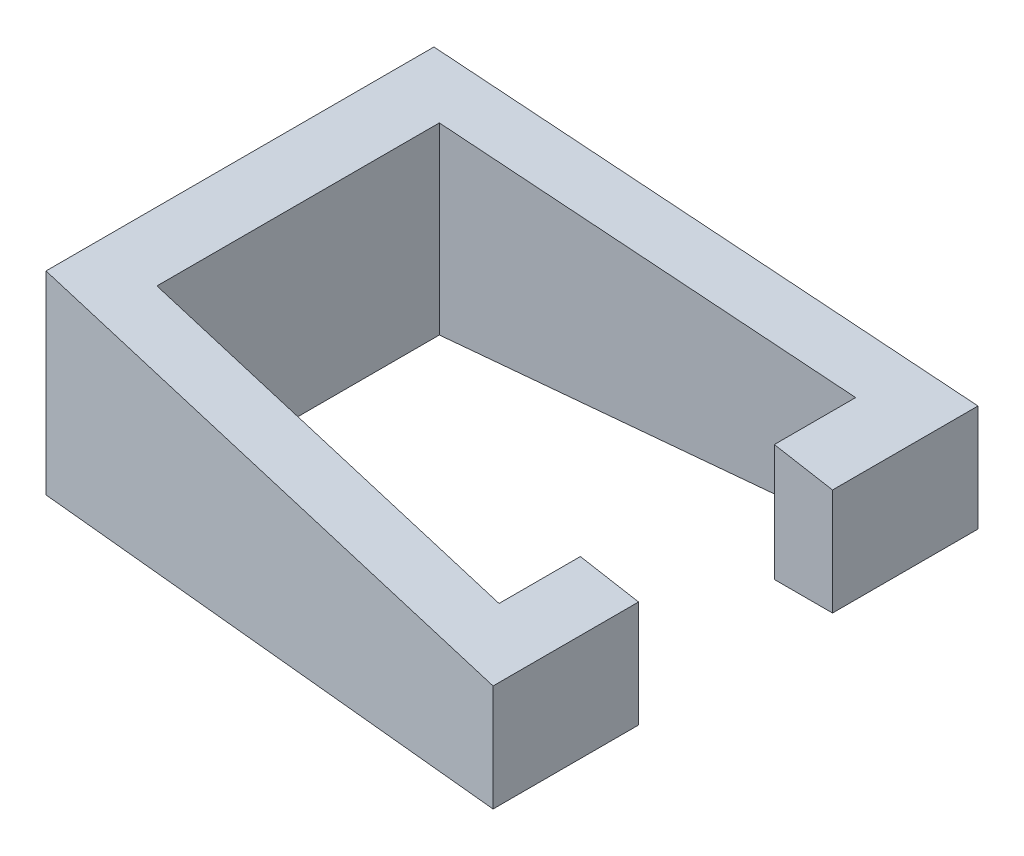
ISO-10303-21;
HEADER;
FILE_DESCRIPTION(('STEP AP214'),'2;1');
FILE_NAME('part.step','',(''),(''),'','','');
FILE_SCHEMA(('AUTOMOTIVE_DESIGN { 1 0 10303 214 1 1 1 1 }'));
ENDSEC;
DATA;
#1=APPLICATION_CONTEXT('core data for automotive mechanical design processes');
#2=APPLICATION_PROTOCOL_DEFINITION('international standard','automotive_design',2000,#1);
#3=PRODUCT_CONTEXT('',#1,'mechanical');
#4=PRODUCT('Part','Part','',(#3));
#5=PRODUCT_RELATED_PRODUCT_CATEGORY('part','',(#4));
#6=PRODUCT_DEFINITION_FORMATION('','',#4);
#7=PRODUCT_DEFINITION_CONTEXT('part definition',#1,'design');
#8=PRODUCT_DEFINITION('design','',#6,#7);
#9=PRODUCT_DEFINITION_SHAPE('','',#8);
#10=(LENGTH_UNIT() NAMED_UNIT(*) SI_UNIT(.MILLI.,.METRE.));
#11=(NAMED_UNIT(*) PLANE_ANGLE_UNIT() SI_UNIT($,.RADIAN.));
#12=(NAMED_UNIT(*) SI_UNIT($,.STERADIAN.) SOLID_ANGLE_UNIT());
#13=UNCERTAINTY_MEASURE_WITH_UNIT(LENGTH_MEASURE(1.E-05),#10,'distance_accuracy_value','');
#14=(GEOMETRIC_REPRESENTATION_CONTEXT(3) GLOBAL_UNCERTAINTY_ASSIGNED_CONTEXT((#13)) GLOBAL_UNIT_ASSIGNED_CONTEXT((#10,
#11,#12)) REPRESENTATION_CONTEXT('',''));
#15=CARTESIAN_POINT('',(0.,0.,0.));
#16=DIRECTION('',(0.,0.,1.));
#17=DIRECTION('',(1.,0.,0.));
#18=AXIS2_PLACEMENT_3D('',#15,#16,#17);
#19=CARTESIAN_POINT('',(-10.7676915472071,15.,10.));
#20=DIRECTION('',(0.0973899493572263,0.,-0.995246300050493));
#21=DIRECTION('',(-0.995246300050494,0.,-0.0973899493572264));
#22=AXIS2_PLACEMENT_3D('',#19,#20,#21);
#23=PLANE('',#22);
#24=DIRECTION('',(0.,-1.,0.));
#25=VECTOR('',#24,1.);
#26=CARTESIAN_POINT('',(14.7802809750891,15.,12.5));
#27=LINE('',#26,#25);
#28=CARTESIAN_POINT('',(14.7802809750891,5.49520314192087,12.5));
#29=VERTEX_POINT('',#28);
#30=CARTESIAN_POINT('',(14.7802809750891,0.,12.5));
#31=VERTEX_POINT('',#30);
#32=EDGE_CURVE('E11',#29,#31,#27,.T.);
#33=ORIENTED_EDGE('',*,*,#32,.F.);
#34=DIRECTION('',(-0.980266461448434,0.172847425436966,-0.0959240954045315));
#35=VECTOR('',#34,1.);
#36=CARTESIAN_POINT('',(-11.6148742177249,10.1493811624009,9.91709883535978));
#37=LINE('',#36,#35);
#38=CARTESIAN_POINT('',(-10.7676915472071,10.,10.));
#39=VERTEX_POINT('',#38);
#40=EDGE_CURVE('E119',#29,#39,#37,.T.);
#41=ORIENTED_EDGE('',*,*,#40,.T.);
#42=DIRECTION('',(0.,-1.,0.));
#43=VECTOR('',#42,1.);
#44=CARTESIAN_POINT('',(-10.7676915472071,15.,10.));
#45=LINE('',#44,#43);
#46=CARTESIAN_POINT('',(-10.7676915472071,0.,10.));
#47=VERTEX_POINT('',#46);
#48=EDGE_CURVE('E55',#39,#47,#45,.T.);
#49=ORIENTED_EDGE('',*,*,#48,.T.);
#50=DIRECTION('',(0.995246300050494,0.,0.0973899493572263));
#51=VECTOR('',#50,1.);
#52=CARTESIAN_POINT('',(-10.7676915472071,0.,10.));
#53=LINE('',#52,#51);
#54=EDGE_CURVE('E126',#47,#31,#53,.T.);
#55=ORIENTED_EDGE('',*,*,#54,.T.);
#56=EDGE_LOOP('',(#33,#41,#49,#55));
#57=FACE_BOUND('',#56,.T.);
#58=ADVANCED_FACE('F33',(#57),#23,.F.);
#59=CARTESIAN_POINT('',(14.7802809750891,15.,12.5));
#60=DIRECTION('',(-1.,0.,0.));
#61=DIRECTION('',(0.,0.,1.));
#62=AXIS2_PLACEMENT_3D('',#59,#60,#61);
#63=PLANE('',#62);
#64=DIRECTION('',(0.,-1.,0.));
#65=VECTOR('',#64,1.);
#66=CARTESIAN_POINT('',(14.7802809750891,15.,5.));
#67=LINE('',#66,#65);
#68=CARTESIAN_POINT('',(14.7802809750891,5.49520314192087,5.));
#69=VERTEX_POINT('',#68);
#70=CARTESIAN_POINT('',(14.7802809750891,0.,5.));
#71=VERTEX_POINT('',#70);
#72=EDGE_CURVE('E40',#69,#71,#67,.T.);
#73=ORIENTED_EDGE('',*,*,#72,.F.);
#74=DIRECTION('',(0.,0.,1.));
#75=VECTOR('',#74,1.);
#76=CARTESIAN_POINT('',(14.7802809750891,5.49520314192087,-12.5));
#77=LINE('',#76,#75);
#78=EDGE_CURVE('E122',#69,#29,#77,.T.);
#79=ORIENTED_EDGE('',*,*,#78,.T.);
#80=ORIENTED_EDGE('',*,*,#32,.T.);
#81=DIRECTION('',(0.,0.,-1.));
#82=VECTOR('',#81,1.);
#83=CARTESIAN_POINT('',(14.7802809750891,0.,12.5));
#84=LINE('',#83,#82);
#85=EDGE_CURVE('E139',#31,#71,#84,.T.);
#86=ORIENTED_EDGE('',*,*,#85,.T.);
#87=EDGE_LOOP('',(#73,#79,#80,#86));
#88=FACE_BOUND('',#87,.T.);
#89=ADVANCED_FACE('F131',(#88),#63,.F.);
#90=CARTESIAN_POINT('',(14.7802809750891,15.,5.));
#91=DIRECTION('',(0.,0.,1.));
#92=DIRECTION('',(1.,0.,0.));
#93=AXIS2_PLACEMENT_3D('',#90,#91,#92);
#94=PLANE('',#93);
#95=DIRECTION('',(0.,-1.,0.));
#96=VECTOR('',#95,1.);
#97=CARTESIAN_POINT('',(11.7802809750891,15.,5.));
#98=LINE('',#97,#96);
#99=CARTESIAN_POINT('',(11.7802809750891,6.02418408404625,5.));
#100=VERTEX_POINT('',#99);
#101=CARTESIAN_POINT('',(11.7802809750891,0.,5.));
#102=VERTEX_POINT('',#101);
#103=EDGE_CURVE('E190',#100,#102,#98,.T.);
#104=ORIENTED_EDGE('',*,*,#103,.F.);
#105=DIRECTION('',(0.984807753012209,-0.173648177666923,0.));
#106=VECTOR('',#105,1.);
#107=CARTESIAN_POINT('',(13.1548649832483,5.78180783615739,5.));
#108=LINE('',#107,#106);
#109=EDGE_CURVE('E127',#100,#69,#108,.T.);
#110=ORIENTED_EDGE('',*,*,#109,.T.);
#111=ORIENTED_EDGE('',*,*,#72,.T.);
#112=DIRECTION('',(-1.,0.,0.));
#113=VECTOR('',#112,1.);
#114=CARTESIAN_POINT('',(14.7802809750891,0.,5.));
#115=LINE('',#114,#113);
#116=EDGE_CURVE('E141',#71,#102,#115,.T.);
#117=ORIENTED_EDGE('',*,*,#116,.T.);
#118=EDGE_LOOP('',(#104,#110,#111,#117));
#119=FACE_BOUND('',#118,.T.);
#120=ADVANCED_FACE('F193',(#119),#94,.F.);
#121=CARTESIAN_POINT('',(11.7802809750891,15.,9.19210541359998));
#122=DIRECTION('',(1.,0.,0.));
#123=DIRECTION('',(0.,0.,-1.));
#124=AXIS2_PLACEMENT_3D('',#121,#122,#123);
#125=PLANE('',#124);
#126=DIRECTION('',(0.,-1.,0.));
#127=VECTOR('',#126,1.);
#128=CARTESIAN_POINT('',(11.7802809750891,15.,9.19210541359998));
#129=LINE('',#128,#127);
#130=CARTESIAN_POINT('',(11.7802809750891,6.02418408404624,9.19210541359998));
#131=VERTEX_POINT('',#130);
#132=CARTESIAN_POINT('',(11.7802809750891,0.,9.19210541359998));
#133=VERTEX_POINT('',#132);
#134=EDGE_CURVE('E188',#131,#133,#129,.T.);
#135=ORIENTED_EDGE('',*,*,#134,.F.);
#136=DIRECTION('',(0.,0.,-1.));
#137=VECTOR('',#136,1.);
#138=CARTESIAN_POINT('',(11.7802809750891,6.02418408404625,9.19210541359998));
#139=LINE('',#138,#137);
#140=EDGE_CURVE('E203',#131,#100,#139,.T.);
#141=ORIENTED_EDGE('',*,*,#140,.T.);
#142=ORIENTED_EDGE('',*,*,#103,.T.);
#143=DIRECTION('',(0.,0.,1.));
#144=VECTOR('',#143,1.);
#145=CARTESIAN_POINT('',(11.7802809750891,0.,9.19210541359998));
#146=LINE('',#145,#144);
#147=EDGE_CURVE('E147',#102,#133,#146,.T.);
#148=ORIENTED_EDGE('',*,*,#147,.T.);
#149=EDGE_LOOP('',(#135,#141,#142,#148));
#150=FACE_BOUND('',#149,.T.);
#151=ADVANCED_FACE('F201',(#150),#125,.F.);
#152=CARTESIAN_POINT('',(-7.76769154720711,15.,7.2792361531101));
#153=DIRECTION('',(-0.0973899493572264,0.,0.995246300050493));
#154=DIRECTION('',(0.995246300050494,0.,0.0973899493572264));
#155=AXIS2_PLACEMENT_3D('',#152,#153,#154);
#156=PLANE('',#155);
#157=DIRECTION('',(0.,-1.,0.));
#158=VECTOR('',#157,1.);
#159=CARTESIAN_POINT('',(-7.76769154720711,15.,7.2792361531101));
#160=LINE('',#159,#158);
#161=CARTESIAN_POINT('',(-7.76769154720711,9.47101905787463,7.2792361531101));
#162=VERTEX_POINT('',#161);
#163=CARTESIAN_POINT('',(-7.76769154720711,0.,7.2792361531101));
#164=VERTEX_POINT('',#163);
#165=EDGE_CURVE('E186',#162,#164,#160,.T.);
#166=ORIENTED_EDGE('',*,*,#165,.F.);
#167=DIRECTION('',(0.980266461448434,-0.172847425436966,0.0959240954045315));
#168=VECTOR('',#167,1.);
#169=CARTESIAN_POINT('',(-8.70450291516551,9.63620417788009,7.18756436123495));
#170=LINE('',#169,#168);
#171=EDGE_CURVE('E205',#162,#131,#170,.T.);
#172=ORIENTED_EDGE('',*,*,#171,.T.);
#173=ORIENTED_EDGE('',*,*,#134,.T.);
#174=DIRECTION('',(-0.995246300050493,0.,-0.0973899493572263));
#175=VECTOR('',#174,1.);
#176=CARTESIAN_POINT('',(-7.76769154720711,0.,7.2792361531101));
#177=LINE('',#176,#175);
#178=EDGE_CURVE('E150',#133,#164,#177,.T.);
#179=ORIENTED_EDGE('',*,*,#178,.T.);
#180=EDGE_LOOP('',(#166,#172,#173,#179));
#181=FACE_BOUND('',#180,.T.);
#182=ADVANCED_FACE('F258',(#181),#156,.F.);
#183=CARTESIAN_POINT('',(-7.76769154720711,15.,0.));
#184=DIRECTION('',(-1.,0.,0.));
#185=DIRECTION('',(0.,0.,1.));
#186=AXIS2_PLACEMENT_3D('',#183,#184,#185);
#187=PLANE('',#186);
#188=DIRECTION('',(0.,-1.,0.));
#189=VECTOR('',#188,1.);
#190=CARTESIAN_POINT('',(-7.76769154720711,15.,-7.2792361531101));
#191=LINE('',#190,#189);
#192=CARTESIAN_POINT('',(-7.76769154720711,9.47101905787462,-7.2792361531101));
#193=VERTEX_POINT('',#192);
#194=CARTESIAN_POINT('',(-7.76769154720711,0.,-7.2792361531101));
#195=VERTEX_POINT('',#194);
#196=EDGE_CURVE('E184',#193,#195,#191,.T.);
#197=ORIENTED_EDGE('',*,*,#196,.F.);
#198=DIRECTION('',(0.,0.,1.));
#199=VECTOR('',#198,1.);
#200=CARTESIAN_POINT('',(-7.76769154720711,9.47101905787463,0.));
#201=LINE('',#200,#199);
#202=EDGE_CURVE('E207',#193,#162,#201,.T.);
#203=ORIENTED_EDGE('',*,*,#202,.T.);
#204=ORIENTED_EDGE('',*,*,#165,.T.);
#205=DIRECTION('',(0.,0.,-1.));
#206=VECTOR('',#205,1.);
#207=CARTESIAN_POINT('',(-7.76769154720711,0.,0.));
#208=LINE('',#207,#206);
#209=EDGE_CURVE('E153',#164,#195,#208,.T.);
#210=ORIENTED_EDGE('',*,*,#209,.T.);
#211=EDGE_LOOP('',(#197,#203,#204,#210));
#212=FACE_BOUND('',#211,.T.);
#213=ADVANCED_FACE('F261',(#212),#187,.F.);
#214=CARTESIAN_POINT('',(-7.76769154720711,15.,-7.2792361531101));
#215=DIRECTION('',(-0.0973899493572263,0.,-0.995246300050494));
#216=DIRECTION('',(-0.995246300050494,0.,0.0973899493572263));
#217=AXIS2_PLACEMENT_3D('',#214,#215,#216);
#218=PLANE('',#217);
#219=DIRECTION('',(0.,-1.,0.));
#220=VECTOR('',#219,1.);
#221=CARTESIAN_POINT('',(11.7802809750891,15.,-9.19210541359998));
#222=LINE('',#221,#220);
#223=CARTESIAN_POINT('',(11.7802809750891,6.02418408404625,-9.19210541359998));
#224=VERTEX_POINT('',#223);
#225=CARTESIAN_POINT('',(11.7802809750891,0.,-9.19210541359998));
#226=VERTEX_POINT('',#225);
#227=EDGE_CURVE('E182',#224,#226,#222,.T.);
#228=ORIENTED_EDGE('',*,*,#227,.F.);
#229=DIRECTION('',(-0.980266461448434,0.172847425436966,0.0959240954045314));
#230=VECTOR('',#229,1.);
#231=CARTESIAN_POINT('',(-8.7045029151655,9.63620417788009,-7.18756436123495));
#232=LINE('',#231,#230);
#233=EDGE_CURVE('E212',#224,#193,#232,.T.);
#234=ORIENTED_EDGE('',*,*,#233,.T.);
#235=ORIENTED_EDGE('',*,*,#196,.T.);
#236=DIRECTION('',(0.995246300050494,0.,-0.0973899493572263));
#237=VECTOR('',#236,1.);
#238=CARTESIAN_POINT('',(-7.76769154720711,0.,-7.2792361531101));
#239=LINE('',#238,#237);
#240=EDGE_CURVE('E156',#195,#226,#239,.T.);
#241=ORIENTED_EDGE('',*,*,#240,.T.);
#242=EDGE_LOOP('',(#228,#234,#235,#241));
#243=FACE_BOUND('',#242,.T.);
#244=ADVANCED_FACE('F265',(#243),#218,.F.);
#245=CARTESIAN_POINT('',(11.7802809750891,15.,-9.19210541359998));
#246=DIRECTION('',(1.,0.,0.));
#247=DIRECTION('',(0.,0.,-1.));
#248=AXIS2_PLACEMENT_3D('',#245,#246,#247);
#249=PLANE('',#248);
#250=DIRECTION('',(0.,-1.,0.));
#251=VECTOR('',#250,1.);
#252=CARTESIAN_POINT('',(11.7802809750891,15.,-5.));
#253=LINE('',#252,#251);
#254=CARTESIAN_POINT('',(11.7802809750891,6.02418408404625,-5.));
#255=VERTEX_POINT('',#254);
#256=CARTESIAN_POINT('',(11.7802809750891,0.,-5.));
#257=VERTEX_POINT('',#256);
#258=EDGE_CURVE('E180',#255,#257,#253,.T.);
#259=ORIENTED_EDGE('',*,*,#258,.F.);
#260=DIRECTION('',(0.,0.,-1.));
#261=VECTOR('',#260,1.);
#262=CARTESIAN_POINT('',(11.7802809750891,6.02418408404625,-9.19210541359998));
#263=LINE('',#262,#261);
#264=EDGE_CURVE('E215',#255,#224,#263,.T.);
#265=ORIENTED_EDGE('',*,*,#264,.T.);
#266=ORIENTED_EDGE('',*,*,#227,.T.);
#267=DIRECTION('',(0.,0.,1.));
#268=VECTOR('',#267,1.);
#269=CARTESIAN_POINT('',(11.7802809750891,0.,-9.19210541359998));
#270=LINE('',#269,#268);
#271=EDGE_CURVE('E159',#226,#257,#270,.T.);
#272=ORIENTED_EDGE('',*,*,#271,.T.);
#273=EDGE_LOOP('',(#259,#265,#266,#272));
#274=FACE_BOUND('',#273,.T.);
#275=ADVANCED_FACE('F269',(#274),#249,.F.);
#276=CARTESIAN_POINT('',(14.7802809750891,15.,-5.));
#277=DIRECTION('',(0.,0.,-1.));
#278=DIRECTION('',(-1.,0.,0.));
#279=AXIS2_PLACEMENT_3D('',#276,#277,#278);
#280=PLANE('',#279);
#281=DIRECTION('',(0.,-1.,0.));
#282=VECTOR('',#281,1.);
#283=CARTESIAN_POINT('',(14.7802809750891,15.,-5.));
#284=LINE('',#283,#282);
#285=CARTESIAN_POINT('',(14.7802809750891,5.49520314192087,-5.));
#286=VERTEX_POINT('',#285);
#287=CARTESIAN_POINT('',(14.7802809750891,0.,-5.));
#288=VERTEX_POINT('',#287);
#289=EDGE_CURVE('E178',#286,#288,#284,.T.);
#290=ORIENTED_EDGE('',*,*,#289,.F.);
#291=DIRECTION('',(-0.984807753012209,0.173648177666923,0.));
#292=VECTOR('',#291,1.);
#293=CARTESIAN_POINT('',(13.1548649832483,5.78180783615739,-5.));
#294=LINE('',#293,#292);
#295=EDGE_CURVE('E218',#286,#255,#294,.T.);
#296=ORIENTED_EDGE('',*,*,#295,.T.);
#297=ORIENTED_EDGE('',*,*,#258,.T.);
#298=DIRECTION('',(1.,0.,0.));
#299=VECTOR('',#298,1.);
#300=CARTESIAN_POINT('',(14.7802809750891,0.,-5.));
#301=LINE('',#300,#299);
#302=EDGE_CURVE('E162',#257,#288,#301,.T.);
#303=ORIENTED_EDGE('',*,*,#302,.T.);
#304=EDGE_LOOP('',(#290,#296,#297,#303));
#305=FACE_BOUND('',#304,.T.);
#306=ADVANCED_FACE('F228',(#305),#280,.F.);
#307=CARTESIAN_POINT('',(14.7802809750891,15.,-12.5));
#308=DIRECTION('',(-1.,0.,0.));
#309=DIRECTION('',(0.,0.,1.));
#310=AXIS2_PLACEMENT_3D('',#307,#308,#309);
#311=PLANE('',#310);
#312=DIRECTION('',(0.,-1.,0.));
#313=VECTOR('',#312,1.);
#314=CARTESIAN_POINT('',(14.7802809750891,15.,-12.5));
#315=LINE('',#314,#313);
#316=CARTESIAN_POINT('',(14.7802809750891,5.49520314192087,-12.5));
#317=VERTEX_POINT('',#316);
#318=CARTESIAN_POINT('',(14.7802809750891,0.,-12.5));
#319=VERTEX_POINT('',#318);
#320=EDGE_CURVE('E176',#317,#319,#315,.T.);
#321=ORIENTED_EDGE('',*,*,#320,.F.);
#322=EDGE_CURVE('E134',#317,#286,#77,.T.);
#323=ORIENTED_EDGE('',*,*,#322,.T.);
#324=ORIENTED_EDGE('',*,*,#289,.T.);
#325=DIRECTION('',(0.,0.,-1.));
#326=VECTOR('',#325,1.);
#327=CARTESIAN_POINT('',(14.7802809750891,0.,-12.5));
#328=LINE('',#327,#326);
#329=EDGE_CURVE('E165',#288,#319,#328,.T.);
#330=ORIENTED_EDGE('',*,*,#329,.T.);
#331=EDGE_LOOP('',(#321,#323,#324,#330));
#332=FACE_BOUND('',#331,.T.);
#333=ADVANCED_FACE('F226',(#332),#311,.F.);
#334=CARTESIAN_POINT('',(-10.7676915472071,15.,-10.));
#335=DIRECTION('',(0.0973899493572263,0.,0.995246300050493));
#336=DIRECTION('',(0.995246300050494,0.,-0.0973899493572264));
#337=AXIS2_PLACEMENT_3D('',#334,#335,#336);
#338=PLANE('',#337);
#339=DIRECTION('',(0.,-1.,0.));
#340=VECTOR('',#339,1.);
#341=CARTESIAN_POINT('',(-10.7676915472071,15.,-10.));
#342=LINE('',#341,#340);
#343=CARTESIAN_POINT('',(-10.7676915472071,10.,-10.));
#344=VERTEX_POINT('',#343);
#345=CARTESIAN_POINT('',(-10.7676915472071,0.,-10.));
#346=VERTEX_POINT('',#345);
#347=EDGE_CURVE('E174',#344,#346,#342,.T.);
#348=ORIENTED_EDGE('',*,*,#347,.F.);
#349=DIRECTION('',(0.980266461448434,-0.172847425436966,-0.0959240954045315));
#350=VECTOR('',#349,1.);
#351=CARTESIAN_POINT('',(-11.6148742177249,10.1493811624009,-9.91709883535978));
#352=LINE('',#351,#350);
#353=EDGE_CURVE('E47',#344,#317,#352,.T.);
#354=ORIENTED_EDGE('',*,*,#353,.T.);
#355=ORIENTED_EDGE('',*,*,#320,.T.);
#356=DIRECTION('',(-0.995246300050494,0.,0.0973899493572263));
#357=VECTOR('',#356,1.);
#358=CARTESIAN_POINT('',(-10.7676915472071,0.,-10.));
#359=LINE('',#358,#357);
#360=EDGE_CURVE('E168',#319,#346,#359,.T.);
#361=ORIENTED_EDGE('',*,*,#360,.T.);
#362=EDGE_LOOP('',(#348,#354,#355,#361));
#363=FACE_BOUND('',#362,.T.);
#364=ADVANCED_FACE('F236',(#363),#338,.F.);
#365=CARTESIAN_POINT('',(-10.7676915472071,15.,0.));
#366=DIRECTION('',(1.,0.,0.));
#367=DIRECTION('',(0.,0.,-1.));
#368=AXIS2_PLACEMENT_3D('',#365,#366,#367);
#369=PLANE('',#368);
#370=ORIENTED_EDGE('',*,*,#48,.F.);
#371=DIRECTION('',(0.,0.,1.));
#372=VECTOR('',#371,1.);
#373=CARTESIAN_POINT('',(-10.7676915472071,10.,-12.5));
#374=LINE('',#373,#372);
#375=EDGE_CURVE('E124',#344,#39,#374,.T.);
#376=ORIENTED_EDGE('',*,*,#375,.F.);
#377=ORIENTED_EDGE('',*,*,#347,.T.);
#378=DIRECTION('',(0.,0.,1.));
#379=VECTOR('',#378,1.);
#380=CARTESIAN_POINT('',(-10.7676915472071,0.,0.));
#381=LINE('',#380,#379);
#382=EDGE_CURVE('E171',#346,#47,#381,.T.);
#383=ORIENTED_EDGE('',*,*,#382,.T.);
#384=EDGE_LOOP('',(#370,#376,#377,#383));
#385=FACE_BOUND('',#384,.T.);
#386=ADVANCED_FACE('F238',(#385),#369,.F.);
#387=CARTESIAN_POINT('',(0.,0.,0.));
#388=DIRECTION('',(0.,1.,0.));
#389=DIRECTION('',(0.,0.,1.));
#390=AXIS2_PLACEMENT_3D('',#387,#388,#389);
#391=PLANE('',#390);
#392=ORIENTED_EDGE('',*,*,#54,.F.);
#393=ORIENTED_EDGE('',*,*,#382,.F.);
#394=ORIENTED_EDGE('',*,*,#360,.F.);
#395=ORIENTED_EDGE('',*,*,#329,.F.);
#396=ORIENTED_EDGE('',*,*,#302,.F.);
#397=ORIENTED_EDGE('',*,*,#271,.F.);
#398=ORIENTED_EDGE('',*,*,#240,.F.);
#399=ORIENTED_EDGE('',*,*,#209,.F.);
#400=ORIENTED_EDGE('',*,*,#178,.F.);
#401=ORIENTED_EDGE('',*,*,#147,.F.);
#402=ORIENTED_EDGE('',*,*,#116,.F.);
#403=ORIENTED_EDGE('',*,*,#85,.F.);
#404=EDGE_LOOP('',(#392,#393,#394,#395,#396,#397,#398,#399,#400,#401,#402,#403));
#405=FACE_BOUND('',#404,.T.);
#406=ADVANCED_FACE('F196',(#405),#391,.F.);
#407=CARTESIAN_POINT('',(14.7802809750891,5.49520314192087,-12.5));
#408=DIRECTION('',(-0.173648177666923,-0.984807753012209,0.));
#409=DIRECTION('',(0.984807753012209,-0.173648177666923,0.));
#410=AXIS2_PLACEMENT_3D('',#407,#408,#409);
#411=PLANE('',#410);
#412=ORIENTED_EDGE('',*,*,#78,.F.);
#413=ORIENTED_EDGE('',*,*,#109,.F.);
#414=ORIENTED_EDGE('',*,*,#140,.F.);
#415=ORIENTED_EDGE('',*,*,#171,.F.);
#416=ORIENTED_EDGE('',*,*,#202,.F.);
#417=ORIENTED_EDGE('',*,*,#233,.F.);
#418=ORIENTED_EDGE('',*,*,#264,.F.);
#419=ORIENTED_EDGE('',*,*,#295,.F.);
#420=ORIENTED_EDGE('',*,*,#322,.F.);
#421=ORIENTED_EDGE('',*,*,#353,.F.);
#422=ORIENTED_EDGE('',*,*,#375,.T.);
#423=ORIENTED_EDGE('',*,*,#40,.F.);
#424=EDGE_LOOP('',(#412,#413,#414,#415,#416,#417,#418,#419,#420,#421,#422,#423));
#425=FACE_BOUND('',#424,.T.);
#426=ADVANCED_FACE('F121',(#425),#411,.F.);
#427=CLOSED_SHELL('',(#58,#89,#120,#151,#182,#213,#244,#275,#306,#333,#364,#386,#406,#426));
#428=MANIFOLD_SOLID_BREP('B2',#427);
#429=ADVANCED_BREP_SHAPE_REPRESENTATION('',(#18,#428),#14);
#430=SHAPE_DEFINITION_REPRESENTATION(#9,#429);
ENDSEC;
END-ISO-10303-21;
